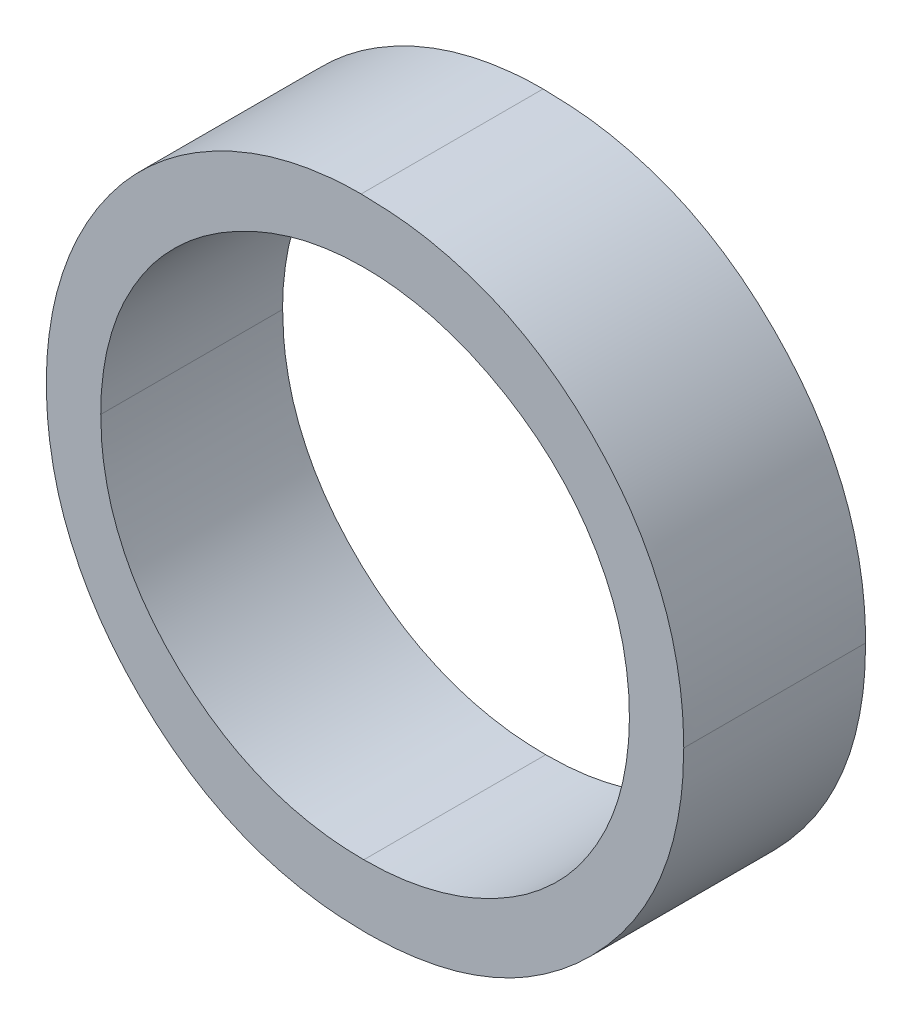
ISO-10303-21;
HEADER;
FILE_DESCRIPTION(('STEP AP214'),'2;1');
FILE_NAME('part.step','',(''),(''),'','','');
FILE_SCHEMA(('AUTOMOTIVE_DESIGN { 1 0 10303 214 1 1 1 1 }'));
ENDSEC;
DATA;
#1=APPLICATION_CONTEXT('core data for automotive mechanical design processes');
#2=APPLICATION_PROTOCOL_DEFINITION('international standard','automotive_design',2000,#1);
#3=PRODUCT_CONTEXT('',#1,'mechanical');
#4=PRODUCT('Part','Part','',(#3));
#5=PRODUCT_RELATED_PRODUCT_CATEGORY('part','',(#4));
#6=PRODUCT_DEFINITION_FORMATION('','',#4);
#7=PRODUCT_DEFINITION_CONTEXT('part definition',#1,'design');
#8=PRODUCT_DEFINITION('design','',#6,#7);
#9=PRODUCT_DEFINITION_SHAPE('','',#8);
#10=(LENGTH_UNIT() NAMED_UNIT(*) SI_UNIT(.MILLI.,.METRE.));
#11=(NAMED_UNIT(*) PLANE_ANGLE_UNIT() SI_UNIT($,.RADIAN.));
#12=(NAMED_UNIT(*) SI_UNIT($,.STERADIAN.) SOLID_ANGLE_UNIT());
#13=UNCERTAINTY_MEASURE_WITH_UNIT(LENGTH_MEASURE(1.E-05),#10,'distance_accuracy_value','');
#14=(GEOMETRIC_REPRESENTATION_CONTEXT(3) GLOBAL_UNCERTAINTY_ASSIGNED_CONTEXT((#13)) GLOBAL_UNIT_ASSIGNED_CONTEXT((#10,
#11,#12)) REPRESENTATION_CONTEXT('',''));
#15=CARTESIAN_POINT('',(0.,0.,0.));
#16=DIRECTION('',(0.,0.,1.));
#17=DIRECTION('',(1.,0.,0.));
#18=AXIS2_PLACEMENT_3D('',#15,#16,#17);
#19=CARTESIAN_POINT('',(-54.9444995379631,-18.5212303557436,1.5));
#20=DIRECTION('',(0.,0.,1.));
#21=DIRECTION('',(1.,0.,0.));
#22=AXIS2_PLACEMENT_3D('',#19,#20,#21);
#23=PLANE('',#22);
#24=CARTESIAN_POINT('',(-55.6888755822798,-20.3921543326411,1.5));
#25=CARTESIAN_POINT('',(-55.6881118172725,-20.3326790910173,1.5));
#26=CARTESIAN_POINT('',(-55.6865939224955,-20.2144789145793,1.5));
#27=CARTESIAN_POINT('',(-55.6683200761115,-20.0389552000759,1.5));
#28=CARTESIAN_POINT('',(-55.6418033601019,-19.8662542604088,1.5));
#29=CARTESIAN_POINT('',(-55.6038006278884,-19.6968671918883,1.5));
#30=CARTESIAN_POINT('',(-55.5540982464792,-19.5312086423136,1.5));
#31=CARTESIAN_POINT('',(-55.4954524930645,-19.368136123976,1.5));
#32=CARTESIAN_POINT('',(-55.4238241425538,-19.2093022329111,1.5));
#33=CARTESIAN_POINT('',(-55.3428517882126,-19.0539545304666,1.5));
#34=CARTESIAN_POINT('',(-55.2524777767514,-18.9045146649862,1.5));
#35=CARTESIAN_POINT('',(-55.1526552775343,-18.7632581176275,1.5));
#36=CARTESIAN_POINT('',(-55.0468904654373,-18.6289995507957,1.5));
#37=CARTESIAN_POINT('',(-54.9309427602544,-18.5052181167399,1.5));
#38=CARTESIAN_POINT('',(-54.8086335528322,-18.3883128933257,1.5));
#39=CARTESIAN_POINT('',(-54.6779787269262,-18.2800804404397,1.5));
#40=CARTESIAN_POINT('',(-54.5397755206897,-18.1795447962161,1.5));
#41=CARTESIAN_POINT('',(-54.3934292638817,-18.0889443089583,1.5));
#42=CARTESIAN_POINT('',(-54.2425460140538,-18.0070026880785,1.5));
#43=CARTESIAN_POINT('',(-54.0870077600833,-17.9366857581032,1.5));
#44=CARTESIAN_POINT('',(-53.9289269436466,-17.8763342416596,1.5));
#45=CARTESIAN_POINT('',(-53.7675631608959,-17.8274187770924,1.5));
#46=CARTESIAN_POINT('',(-53.6033449150669,-17.7888015828181,1.5));
#47=CARTESIAN_POINT('',(-53.4359137942485,-17.762505363234,1.5));
#48=CARTESIAN_POINT('',(-53.2654031852779,-17.744184909109,1.5));
#49=CARTESIAN_POINT('',(-53.1505298724922,-17.7426741919814,1.5));
#50=CARTESIAN_POINT('',(-53.0927217361259,-17.7419139480257,1.5));
#51=B_SPLINE_CURVE_WITH_KNOTS('',3,(#24,#25,#26,#27,#28,#29,#30,#31,#32,#33,#34,#35,#36,#37,#38,
#39,#40,#41,#42,#43,#44,#45,#46,#47,#48,#49,#50),.UNSPECIFIED.,.F.,.F.,(4,1,1,1,1,1,1,1,1,1,1,1,
1,1,1,1,1,1,1,1,1,1,1,1,4),(0.,0.0432089861713361,0.085872871630619,0.128120006696702,
0.170151964454199,0.211917620987861,0.253753002619124,0.29600640885595,0.338443357144784,
0.381015368162033,0.42282047944076,0.464089055794314,0.505125848683686,0.545974970685241,
0.586985211133859,0.628338591634663,0.670083801591206,0.711991602363722,0.753039154863019,
0.794049395311638,0.834885542701582,0.875498312929514,0.916547299830379,0.95800377864496,1.),.UNSPECIFIED.);
#52=CARTESIAN_POINT('',(-55.6888755822798,-20.3921543326411,1.5));
#53=VERTEX_POINT('',#52);
#54=CARTESIAN_POINT('',(-53.0927217361259,-17.7419139480257,1.5));
#55=VERTEX_POINT('',#54);
#56=EDGE_CURVE('E201',#53,#55,#51,.T.);
#57=ORIENTED_EDGE('',*,*,#56,.F.);
#58=CARTESIAN_POINT('',(-53.0526576335618,-22.998324204436,1.5));
#59=CARTESIAN_POINT('',(-53.1432638035327,-22.9961107946441,1.5));
#60=CARTESIAN_POINT('',(-53.3218726834446,-22.991747574746,1.5));
#61=CARTESIAN_POINT('',(-53.5840684482729,-22.954345567886,1.5));
#62=CARTESIAN_POINT('',(-53.8358937966268,-22.8958579910271,1.5));
#63=CARTESIAN_POINT('',(-54.0766285840731,-22.8122730821434,1.5));
#64=CARTESIAN_POINT('',(-54.306407054928,-22.7042484668222,1.5));
#65=CARTESIAN_POINT('',(-54.5256786016345,-22.5725279253008,1.5));
#66=CARTESIAN_POINT('',(-54.733563097694,-22.4162320093285,1.5));
#67=CARTESIAN_POINT('',(-54.9283370212433,-22.2388511884985,1.5));
#68=CARTESIAN_POINT('',(-55.106550161504,-22.0457489713331,1.5));
#69=CARTESIAN_POINT('',(-55.2619206982081,-21.8388428926499,1.5));
#70=CARTESIAN_POINT('',(-55.3936708600927,-21.6221922403021,1.5));
#71=CARTESIAN_POINT('',(-55.5013327636573,-21.395195777284,1.5));
#72=CARTESIAN_POINT('',(-55.5865677055783,-21.1589508591386,1.5));
#73=CARTESIAN_POINT('',(-55.644717445777,-20.9118816055822,1.5));
#74=CARTESIAN_POINT('',(-55.6823402344468,-20.6553965972754,1.5));
#75=CARTESIAN_POINT('',(-55.6866757294207,-20.4807638853821,1.5));
#76=CARTESIAN_POINT('',(-55.6888755822798,-20.3921543326411,1.5));
#77=B_SPLINE_CURVE_WITH_KNOTS('',3,(#58,#59,#60,#61,#62,#63,#64,#65,#66,#67,#68,#69,#70,#71,#72,
#73,#74,#75,#76),.UNSPECIFIED.,.F.,.F.,(4,1,1,1,1,1,1,1,1,1,1,1,1,1,1,1,4),(0.,
0.0658188768433069,0.129746526906831,0.192071954488006,0.253459424298203,0.314569587796421,
0.376279881188026,0.43902565366856,0.503267028829086,0.567492822879294,0.629704795605245,
0.690999649215756,0.751451650917447,0.812004364264694,0.873149681068043,0.935635483731785,1.),.UNSPECIFIED.);
#78=CARTESIAN_POINT('',(-53.0526576335618,-22.998324204436,1.5));
#79=VERTEX_POINT('',#78);
#80=EDGE_CURVE('E160',#79,#53,#77,.T.);
#81=ORIENTED_EDGE('',*,*,#80,.F.);
#82=CARTESIAN_POINT('',(-50.4324653258695,-20.3681158711026,1.5));
#83=CARTESIAN_POINT('',(-50.4346795151897,-20.4580550801834,1.5));
#84=CARTESIAN_POINT('',(-50.439043938855,-20.6353356808005,1.5));
#85=CARTESIAN_POINT('',(-50.4764279067629,-20.8955406010444,1.5));
#86=CARTESIAN_POINT('',(-50.5350579067258,-21.1456701674476,1.5));
#87=CARTESIAN_POINT('',(-50.6187668584152,-21.3853068142689,1.5));
#88=CARTESIAN_POINT('',(-50.7262318276485,-21.6147033339332,1.5));
#89=CARTESIAN_POINT('',(-50.8585963578356,-21.833256125193,1.5));
#90=CARTESIAN_POINT('',(-51.0145123731814,-22.0410368371729,1.5));
#91=CARTESIAN_POINT('',(-51.1919507318005,-22.2357692160638,1.5));
#92=CARTESIAN_POINT('',(-51.3853807918206,-22.4143370313404,1.5));
#93=CARTESIAN_POINT('',(-51.5928526015476,-22.5699354251742,1.5));
#94=CARTESIAN_POINT('',(-51.8097002014362,-22.7038270317441,1.5));
#95=CARTESIAN_POINT('',(-52.0387140702353,-22.8106608516944,1.5));
#96=CARTESIAN_POINT('',(-52.2768569799874,-22.8960493094731,1.5));
#97=CARTESIAN_POINT('',(-52.5262602986853,-22.9542673523751,1.5));
#98=CARTESIAN_POINT('',(-52.7857553758858,-22.9918202713066,1.5));
#99=CARTESIAN_POINT('',(-52.9627139527466,-22.9961324369683,1.5));
#100=CARTESIAN_POINT('',(-53.0526576335618,-22.998324204436,1.5));
#101=B_SPLINE_CURVE_WITH_KNOTS('',3,(#82,#83,#84,#85,#86,#87,#88,#89,#90,#91,#92,#93,#94,#95,
#96,#97,#98,#99,#100),.UNSPECIFIED.,.F.,.F.,(4,1,1,1,1,1,1,1,1,1,1,1,1,1,1,1,4),(0.,
0.0652265038922762,0.128568995706729,0.190320378104467,0.251377988624063,0.312387528333694,
0.373788704276724,0.43643115978045,0.500566755309855,0.564686795384744,0.627135517883514,
0.688455408894979,0.749245746463748,0.810155177364678,0.871670925652924,0.934773496107725,1.),.UNSPECIFIED.);
#102=CARTESIAN_POINT('',(-50.4324653258695,-20.3681158711026,1.5));
#103=VERTEX_POINT('',#102);
#104=EDGE_CURVE('E166',#103,#79,#101,.T.);
#105=ORIENTED_EDGE('',*,*,#104,.F.);
#106=CARTESIAN_POINT('',(-53.0927217361259,-17.7419139480257,1.5));
#107=CARTESIAN_POINT('',(-53.0001387276859,-17.7442589185558,1.5));
#108=CARTESIAN_POINT('',(-52.8182980606058,-17.7488646341472,1.5));
#109=CARTESIAN_POINT('',(-52.5510482067144,-17.7841204963692,1.5));
#110=CARTESIAN_POINT('',(-52.2959123563079,-17.8451139106079,1.5));
#111=CARTESIAN_POINT('',(-52.0508121580197,-17.9263467427232,1.5));
#112=CARTESIAN_POINT('',(-51.8186793343493,-18.03471015041,1.5));
#113=CARTESIAN_POINT('',(-51.5977666307914,-18.1656889337522,1.5));
#114=CARTESIAN_POINT('',(-51.3885996681834,-18.3206553034069,1.5));
#115=CARTESIAN_POINT('',(-51.1939976945714,-18.4984113417663,1.5));
#116=CARTESIAN_POINT('',(-51.015916337024,-18.6918162759114,1.5));
#117=CARTESIAN_POINT('',(-50.8590222137821,-18.8982132903013,1.5));
#118=CARTESIAN_POINT('',(-50.7275332227368,-19.1163544364537,1.5));
#119=CARTESIAN_POINT('',(-50.6195535267865,-19.3455841945133,1.5));
#120=CARTESIAN_POINT('',(-50.5348412272239,-19.5853841487628,1.5));
#121=CARTESIAN_POINT('',(-50.476385450523,-19.8370327241076,1.5));
#122=CARTESIAN_POINT('',(-50.4390452360188,-20.0988994242105,1.5));
#123=CARTESIAN_POINT('',(-50.4346798397224,-20.2775092309587,1.5));
#124=CARTESIAN_POINT('',(-50.4324653258695,-20.3681158711026,1.5));
#125=B_SPLINE_CURVE_WITH_KNOTS('',3,(#106,#107,#108,#109,#110,#111,#112,#113,#114,#115,#116,
#117,#118,#119,#120,#121,#122,#123,#124),.UNSPECIFIED.,.F.,.F.,(4,1,1,1,1,1,1,1,1,1,1,1,1,1,1,1,
4),(0.,0.0665700352151794,0.130749041482178,0.193412800029504,0.254989398889709,
0.316113555875901,0.377261757908984,0.439400784155553,0.502970589371976,0.566524976360731,
0.628231102513308,0.689090610599862,0.749344668995804,0.810169593372206,0.871609824317043,
0.934869184072764,1.),.UNSPECIFIED.);
#126=EDGE_CURVE('E221',#55,#103,#125,.T.);
#127=ORIENTED_EDGE('',*,*,#126,.F.);
#128=EDGE_LOOP('',(#57,#81,#105,#127));
#129=FACE_BOUND('',#128,.T.);
#130=CARTESIAN_POINT('',(-53.0706864797157,-18.2547344608462,1.5));
#131=CARTESIAN_POINT('',(-53.1181359562105,-18.2553128754937,1.5));
#132=CARTESIAN_POINT('',(-53.2125812889727,-18.2564641751052,1.5));
#133=CARTESIAN_POINT('',(-53.3529877693252,-18.2716294830654,1.5));
#134=CARTESIAN_POINT('',(-53.4915476747978,-18.2932436101674,1.5));
#135=CARTESIAN_POINT('',(-53.6282896207573,-18.3240743541167,1.5));
#136=CARTESIAN_POINT('',(-53.7626414627256,-18.3660801437933,1.5));
#137=CARTESIAN_POINT('',(-53.8958555215443,-18.4144242983496,1.5));
#138=CARTESIAN_POINT('',(-54.026717027071,-18.4733115706288,1.5));
#139=CARTESIAN_POINT('',(-54.1547939668658,-18.5398440054426,1.5));
#140=CARTESIAN_POINT('',(-54.2789583599315,-18.6134853208765,1.5));
#141=CARTESIAN_POINT('',(-54.3961193620098,-18.6948735594981,1.5));
#142=CARTESIAN_POINT('',(-54.506580281958,-18.7821000655657,1.5));
#143=CARTESIAN_POINT('',(-54.6100706628904,-18.8753684046761,1.5));
#144=CARTESIAN_POINT('',(-54.7062866231397,-18.9751535500921,1.5));
#145=CARTESIAN_POINT('',(-54.7971219109294,-19.079942744546,1.5));
#146=CARTESIAN_POINT('',(-54.8789355989952,-19.1927311603226,1.5));
#147=CARTESIAN_POINT('',(-54.9539149944622,-19.3104603129896,1.5));
#148=CARTESIAN_POINT('',(-55.0210119091442,-19.4329768575693,1.5));
#149=CARTESIAN_POINT('',(-55.0806767016049,-19.5589909465235,1.5));
#150=CARTESIAN_POINT('',(-55.1294824284699,-19.689530499064,1.5));
#151=CARTESIAN_POINT('',(-55.1692858231615,-19.8231792956015,1.5));
#152=CARTESIAN_POINT('',(-55.2022855529426,-19.9597256665493,1.5));
#153=CARTESIAN_POINT('',(-55.2231911587917,-20.1002054506054,1.5));
#154=CARTESIAN_POINT('',(-55.2385231008612,-20.2439127535048,1.5));
#155=CARTESIAN_POINT('',(-55.2396085943649,-20.3410296878508,1.5));
#156=CARTESIAN_POINT('',(-55.2401576335619,-20.3901511275129,1.5));
#157=B_SPLINE_CURVE_WITH_KNOTS('',3,(#130,#131,#132,#133,#134,#135,#136,#137,#138,#139,#140,
#141,#142,#143,#144,#145,#146,#147,#148,#149,#150,#151,#152,#153,#154,#155,#156),.UNSPECIFIED.,
.F.,.F.,(4,1,1,1,1,1,1,1,1,1,1,1,1,1,1,1,1,1,1,1,1,1,1,1,4),(0.,0.0420233285259239,
0.0836449111687118,0.124983795417394,0.166247461172896,0.207701556096989,0.249631070799649,
0.29174177033213,0.334742875353199,0.377460168550865,0.41955631884194,0.461044176333034,
0.502096283944396,0.5428907140756,0.583800818626506,0.624863583310193,0.66622468906917,
0.707399186477937,0.748556677536694,0.78965459095218,0.830739726489832,0.872070142258604,
0.913993395242132,0.956498130067588,1.),.UNSPECIFIED.);
#158=CARTESIAN_POINT('',(-53.0706864797157,-18.2547344608462,1.5));
#159=VERTEX_POINT('',#158);
#160=CARTESIAN_POINT('',(-55.2401576335619,-20.3901511275129,1.5));
#161=VERTEX_POINT('',#160);
#162=EDGE_CURVE('E108',#159,#161,#157,.T.);
#163=ORIENTED_EDGE('',*,*,#162,.F.);
#164=CARTESIAN_POINT('',(-50.8811832745875,-20.3671142685385,1.5));
#165=CARTESIAN_POINT('',(-50.8817562931277,-20.318663548155,1.5));
#166=CARTESIAN_POINT('',(-50.882892980956,-20.2225526193365,1.5));
#167=CARTESIAN_POINT('',(-50.8979536589908,-20.0804657359631,1.5));
#168=CARTESIAN_POINT('',(-50.9195263595192,-19.9415325767148,1.5));
#169=CARTESIAN_POINT('',(-50.9506159424328,-19.8062985724348,1.5));
#170=CARTESIAN_POINT('',(-50.9906875906265,-19.6747292509108,1.5));
#171=CARTESIAN_POINT('',(-51.0400980626106,-19.5469481827663,1.5));
#172=CARTESIAN_POINT('',(-51.0983627761446,-19.4224793326474,1.5));
#173=CARTESIAN_POINT('',(-51.1652316681184,-19.3016303369334,1.5));
#174=CARTESIAN_POINT('',(-51.2403971302276,-19.1856664255227,1.5));
#175=CARTESIAN_POINT('',(-51.3225317635289,-19.0748058362006,1.5));
#176=CARTESIAN_POINT('',(-51.4130536894448,-18.9711304914712,1.5));
#177=CARTESIAN_POINT('',(-51.5093765821216,-18.8720809285521,1.5));
#178=CARTESIAN_POINT('',(-51.6139064183061,-18.7797696576838,1.5));
#179=CARTESIAN_POINT('',(-51.7261696955619,-18.6941660567445,1.5));
#180=CARTESIAN_POINT('',(-51.8448035209355,-18.6132042363317,1.5));
#181=CARTESIAN_POINT('',(-51.9704138572683,-18.5401677194165,1.5));
#182=CARTESIAN_POINT('',(-52.1000480768853,-18.4727188155405,1.5));
#183=CARTESIAN_POINT('',(-52.2330680168461,-18.4149316681911,1.5));
#184=CARTESIAN_POINT('',(-52.3679667305836,-18.3658286404948,1.5));
#185=CARTESIAN_POINT('',(-52.5044011767724,-18.3239472618512,1.5));
#186=CARTESIAN_POINT('',(-52.6435197172515,-18.2933643616453,1.5));
#187=CARTESIAN_POINT('',(-52.78438232989,-18.2716100047024,1.5));
#188=CARTESIAN_POINT('',(-52.9267941278551,-18.2564694534261,1.5));
#189=CARTESIAN_POINT('',(-53.0225701560316,-18.255314626946,1.5));
#190=CARTESIAN_POINT('',(-53.0706864797157,-18.2547344608462,1.5));
#191=B_SPLINE_CURVE_WITH_KNOTS('',3,(#164,#165,#166,#167,#168,#169,#170,#171,#172,#173,#174,
#175,#176,#177,#178,#179,#180,#181,#182,#183,#184,#185,#186,#187,#188,#189,#190),.UNSPECIFIED.,
.F.,.F.,(4,1,1,1,1,1,1,1,1,1,1,1,1,1,1,1,1,1,1,1,1,1,1,1,4),(0.,0.0429150821010496,
0.0851299705846994,0.126473318554998,0.167453037885388,0.207976332894988,0.24824937806376,
0.288749986983443,0.329669856910872,0.370537286711975,0.411128563917118,0.451818912673638,
0.492405876934263,0.533485861742023,0.575263062441552,0.617440612802191,0.660671688292366,
0.70394020424349,0.74686752215987,0.789079300394724,0.831104042457405,0.873237989854776,
0.915165769659334,0.957380658142984,1.),.UNSPECIFIED.);
#192=CARTESIAN_POINT('',(-50.8811832745875,-20.3671142685385,1.5));
#193=VERTEX_POINT('',#192);
#194=EDGE_CURVE('E100',#193,#159,#191,.T.);
#195=ORIENTED_EDGE('',*,*,#194,.F.);
#196=CARTESIAN_POINT('',(-53.0706864797157,-22.4855036916154,1.5));
#197=CARTESIAN_POINT('',(-53.0212443345554,-22.4848243996638,1.5));
#198=CARTESIAN_POINT('',(-52.9231857111632,-22.4834771597039,1.5));
#199=CARTESIAN_POINT('',(-52.7773349649449,-22.4699076213655,1.5));
#200=CARTESIAN_POINT('',(-52.6341118053293,-22.448147807911,1.5));
#201=CARTESIAN_POINT('',(-52.493717119786,-22.4168182998983,1.5));
#202=CARTESIAN_POINT('',(-52.3563102463768,-22.3776080050011,1.5));
#203=CARTESIAN_POINT('',(-52.2213176704983,-22.3310255364881,1.5));
#204=CARTESIAN_POINT('',(-52.0901772557561,-22.2729095312265,1.5));
#205=CARTESIAN_POINT('',(-51.9612346303258,-22.2086981718279,1.5));
#206=CARTESIAN_POINT('',(-51.8378114279099,-22.1354979467802,1.5));
#207=CARTESIAN_POINT('',(-51.719989238923,-22.0568720186955,1.5));
#208=CARTESIAN_POINT('',(-51.6107378391303,-21.96977398911,1.5));
#209=CARTESIAN_POINT('',(-51.5073248799575,-21.8778913997614,1.5));
#210=CARTESIAN_POINT('',(-51.4107138956824,-21.7793716171083,1.5));
#211=CARTESIAN_POINT('',(-51.3215582039322,-21.6743427287556,1.5));
#212=CARTESIAN_POINT('',(-51.2401580151463,-21.5621417898511,1.5));
#213=CARTESIAN_POINT('',(-51.1652070914191,-21.4445912102221,1.5));
#214=CARTESIAN_POINT('',(-51.0983452874822,-21.3217394206718,1.5));
#215=CARTESIAN_POINT('',(-51.0400894316978,-21.1952684521741,1.5));
#216=CARTESIAN_POINT('',(-50.9906664090796,-21.0654897245074,1.5));
#217=CARTESIAN_POINT('',(-50.9507685450378,-20.9322160509626,1.5));
#218=CARTESIAN_POINT('',(-50.9195035997762,-20.7957005527185,1.5));
#219=CARTESIAN_POINT('',(-50.8979608570505,-20.6557604410595,1.5));
#220=CARTESIAN_POINT('',(-50.8828916589834,-20.5126756660736,1.5));
#221=CARTESIAN_POINT('',(-50.881755834431,-20.4158987289854,1.5));
#222=CARTESIAN_POINT('',(-50.8811832745875,-20.3671142685385,1.5));
#223=B_SPLINE_CURVE_WITH_KNOTS('',3,(#196,#197,#198,#199,#200,#201,#202,#203,#204,#205,#206,
#207,#208,#209,#210,#211,#212,#213,#214,#215,#216,#217,#218,#219,#220,#221,#222),.UNSPECIFIED.,
.F.,.F.,(4,1,1,1,1,1,1,1,1,1,1,1,1,1,1,1,1,1,1,1,1,1,1,1,4),(0.,0.0436332182657575,
0.0865377766972015,0.129177336089891,0.171436323663827,0.213415894570908,0.255265954553849,
0.297369481156622,0.339940747898556,0.382347458751811,0.423952946815271,0.464871163261017,
0.505572294118272,0.546002577108316,0.586567974806912,0.627064799148167,0.668270684033174,
0.709549224850333,0.750428153513189,0.791096194448592,0.832027144779434,0.873135955335967,
0.914610764365448,0.956955986480437,1.),.UNSPECIFIED.);
#224=CARTESIAN_POINT('',(-53.0706864797157,-22.4855036916154,1.5));
#225=VERTEX_POINT('',#224);
#226=EDGE_CURVE('E122',#225,#193,#223,.T.);
#227=ORIENTED_EDGE('',*,*,#226,.F.);
#228=CARTESIAN_POINT('',(-55.2401576335619,-20.3901511275129,1.5));
#229=CARTESIAN_POINT('',(-55.2383364021939,-20.4623828715172,1.5));
#230=CARTESIAN_POINT('',(-55.2347534766767,-20.6044850576033,1.5));
#231=CARTESIAN_POINT('',(-55.2033855193691,-20.8127252631532,1.5));
#232=CARTESIAN_POINT('',(-55.1550684130079,-21.0128513865018,1.5));
#233=CARTESIAN_POINT('',(-55.0838436038126,-21.2037683997783,1.5));
#234=CARTESIAN_POINT('',(-54.9947712971588,-21.3871173752519,1.5));
#235=CARTESIAN_POINT('',(-54.8847328824807,-21.5612718105197,1.5));
#236=CARTESIAN_POINT('',(-54.7543627602392,-21.7262787738964,1.5));
#237=CARTESIAN_POINT('',(-54.6062720079509,-21.880986300996,1.5));
#238=CARTESIAN_POINT('',(-54.4443824270944,-22.0221945927667,1.5));
#239=CARTESIAN_POINT('',(-54.2724785271958,-22.1461423194026,1.5));
#240=CARTESIAN_POINT('',(-54.0924019450711,-22.2510141048647,1.5));
#241=CARTESIAN_POINT('',(-53.9036830840533,-22.3364499225552,1.5));
#242=CARTESIAN_POINT('',(-53.7073294568685,-22.4041495479824,1.5));
#243=CARTESIAN_POINT('',(-53.5020758125293,-22.4505475924503,1.5));
#244=CARTESIAN_POINT('',(-53.2892894416956,-22.4810839572616,1.5));
#245=CARTESIAN_POINT('',(-53.1442456486097,-22.4840164657203,1.5));
#246=CARTESIAN_POINT('',(-53.0706864797157,-22.4855036916154,1.5));
#247=B_SPLINE_CURVE_WITH_KNOTS('',3,(#228,#229,#230,#231,#232,#233,#234,#235,#236,#237,#238,
#239,#240,#241,#242,#243,#244,#245,#246),.UNSPECIFIED.,.F.,.F.,(4,1,1,1,1,1,1,1,1,1,1,1,1,1,1,1,
4),(0.,0.0645039992970557,0.126899321590039,0.187746540100011,0.248149732929826,
0.308586064762742,0.369583005086994,0.431826965381049,0.496179722524157,0.56066785461188,
0.623504455117664,0.685260411330427,0.746536821751166,0.808327351736707,0.870486187887767,
0.934316883359246,1.),.UNSPECIFIED.);
#248=EDGE_CURVE('E120',#161,#225,#247,.T.);
#249=ORIENTED_EDGE('',*,*,#248,.F.);
#250=EDGE_LOOP('',(#163,#195,#227,#249));
#251=FACE_BOUND('',#250,.T.);
#252=ADVANCED_FACE('F33',(#129,#251),#23,.T.);
#253=CARTESIAN_POINT('',(-54.9444995379631,-18.5212303557436,0.));
#254=DIRECTION('',(0.,0.,1.));
#255=DIRECTION('',(1.,0.,0.));
#256=AXIS2_PLACEMENT_3D('',#253,#254,#255);
#257=PLANE('',#256);
#258=CARTESIAN_POINT('',(-55.6888755822798,-20.3921543326411,0.));
#259=CARTESIAN_POINT('',(-55.6881118172725,-20.3326790910173,0.));
#260=CARTESIAN_POINT('',(-55.6865939224955,-20.2144789145793,0.));
#261=CARTESIAN_POINT('',(-55.6683200761115,-20.0389552000759,0.));
#262=CARTESIAN_POINT('',(-55.6418033601019,-19.8662542604088,0.));
#263=CARTESIAN_POINT('',(-55.6038006278884,-19.6968671918883,0.));
#264=CARTESIAN_POINT('',(-55.5540982464792,-19.5312086423136,0.));
#265=CARTESIAN_POINT('',(-55.4954524930645,-19.368136123976,0.));
#266=CARTESIAN_POINT('',(-55.4238241425538,-19.2093022329111,0.));
#267=CARTESIAN_POINT('',(-55.3428517882126,-19.0539545304666,0.));
#268=CARTESIAN_POINT('',(-55.2524777767514,-18.9045146649862,0.));
#269=CARTESIAN_POINT('',(-55.1526552775343,-18.7632581176275,0.));
#270=CARTESIAN_POINT('',(-55.0468904654373,-18.6289995507957,0.));
#271=CARTESIAN_POINT('',(-54.9309427602544,-18.5052181167399,0.));
#272=CARTESIAN_POINT('',(-54.8086335528322,-18.3883128933257,0.));
#273=CARTESIAN_POINT('',(-54.6779787269262,-18.2800804404397,0.));
#274=CARTESIAN_POINT('',(-54.5397755206897,-18.1795447962161,0.));
#275=CARTESIAN_POINT('',(-54.3934292638817,-18.0889443089583,0.));
#276=CARTESIAN_POINT('',(-54.2425460140538,-18.0070026880785,0.));
#277=CARTESIAN_POINT('',(-54.0870077600833,-17.9366857581032,0.));
#278=CARTESIAN_POINT('',(-53.9289269436466,-17.8763342416596,0.));
#279=CARTESIAN_POINT('',(-53.7675631608959,-17.8274187770924,0.));
#280=CARTESIAN_POINT('',(-53.6033449150669,-17.7888015828181,0.));
#281=CARTESIAN_POINT('',(-53.4359137942485,-17.762505363234,0.));
#282=CARTESIAN_POINT('',(-53.2654031852779,-17.744184909109,0.));
#283=CARTESIAN_POINT('',(-53.1505298724922,-17.7426741919814,0.));
#284=CARTESIAN_POINT('',(-53.0927217361259,-17.7419139480257,0.));
#285=B_SPLINE_CURVE_WITH_KNOTS('',3,(#258,#259,#260,#261,#262,#263,#264,#265,#266,#267,#268,
#269,#270,#271,#272,#273,#274,#275,#276,#277,#278,#279,#280,#281,#282,#283,#284),.UNSPECIFIED.,
.F.,.F.,(4,1,1,1,1,1,1,1,1,1,1,1,1,1,1,1,1,1,1,1,1,1,1,1,4),(0.,0.0432089861713361,
0.085872871630619,0.128120006696702,0.170151964454199,0.211917620987861,0.253753002619124,
0.29600640885595,0.338443357144784,0.381015368162033,0.42282047944076,0.464089055794314,
0.505125848683686,0.545974970685241,0.586985211133859,0.628338591634663,0.670083801591206,
0.711991602363722,0.753039154863019,0.794049395311638,0.834885542701582,0.875498312929514,
0.916547299830379,0.95800377864496,1.),.UNSPECIFIED.);
#286=CARTESIAN_POINT('',(-55.6888755822798,-20.3921543326411,0.));
#287=VERTEX_POINT('',#286);
#288=CARTESIAN_POINT('',(-53.0927217361259,-17.7419139480257,0.));
#289=VERTEX_POINT('',#288);
#290=EDGE_CURVE('E116',#287,#289,#285,.T.);
#291=ORIENTED_EDGE('',*,*,#290,.T.);
#292=CARTESIAN_POINT('',(-53.0927217361259,-17.7419139480257,0.));
#293=CARTESIAN_POINT('',(-53.0001387276859,-17.7442589185558,0.));
#294=CARTESIAN_POINT('',(-52.8182980606058,-17.7488646341472,0.));
#295=CARTESIAN_POINT('',(-52.5510482067144,-17.7841204963692,0.));
#296=CARTESIAN_POINT('',(-52.2959123563079,-17.8451139106079,0.));
#297=CARTESIAN_POINT('',(-52.0508121580197,-17.9263467427232,0.));
#298=CARTESIAN_POINT('',(-51.8186793343493,-18.03471015041,0.));
#299=CARTESIAN_POINT('',(-51.5977666307914,-18.1656889337522,0.));
#300=CARTESIAN_POINT('',(-51.3885996681834,-18.3206553034069,0.));
#301=CARTESIAN_POINT('',(-51.1939976945714,-18.4984113417663,0.));
#302=CARTESIAN_POINT('',(-51.015916337024,-18.6918162759114,0.));
#303=CARTESIAN_POINT('',(-50.8590222137821,-18.8982132903013,0.));
#304=CARTESIAN_POINT('',(-50.7275332227368,-19.1163544364537,0.));
#305=CARTESIAN_POINT('',(-50.6195535267865,-19.3455841945133,0.));
#306=CARTESIAN_POINT('',(-50.5348412272239,-19.5853841487628,0.));
#307=CARTESIAN_POINT('',(-50.476385450523,-19.8370327241076,0.));
#308=CARTESIAN_POINT('',(-50.4390452360188,-20.0988994242105,0.));
#309=CARTESIAN_POINT('',(-50.4346798397224,-20.2775092309587,0.));
#310=CARTESIAN_POINT('',(-50.4324653258695,-20.3681158711026,0.));
#311=B_SPLINE_CURVE_WITH_KNOTS('',3,(#292,#293,#294,#295,#296,#297,#298,#299,#300,#301,#302,
#303,#304,#305,#306,#307,#308,#309,#310),.UNSPECIFIED.,.F.,.F.,(4,1,1,1,1,1,1,1,1,1,1,1,1,1,1,1,
4),(0.,0.0665700352151794,0.130749041482178,0.193412800029504,0.254989398889709,
0.316113555875901,0.377261757908984,0.439400784155553,0.502970589371976,0.566524976360731,
0.628231102513308,0.689090610599862,0.749344668995804,0.810169593372206,0.871609824317043,
0.934869184072764,1.),.UNSPECIFIED.);
#312=CARTESIAN_POINT('',(-50.4324653258695,-20.3681158711026,0.));
#313=VERTEX_POINT('',#312);
#314=EDGE_CURVE('E178',#289,#313,#311,.T.);
#315=ORIENTED_EDGE('',*,*,#314,.T.);
#316=CARTESIAN_POINT('',(-50.4324653258695,-20.3681158711026,0.));
#317=CARTESIAN_POINT('',(-50.4346795151897,-20.4580550801834,0.));
#318=CARTESIAN_POINT('',(-50.439043938855,-20.6353356808005,0.));
#319=CARTESIAN_POINT('',(-50.4764279067629,-20.8955406010444,0.));
#320=CARTESIAN_POINT('',(-50.5350579067258,-21.1456701674476,0.));
#321=CARTESIAN_POINT('',(-50.6187668584152,-21.3853068142689,0.));
#322=CARTESIAN_POINT('',(-50.7262318276485,-21.6147033339332,0.));
#323=CARTESIAN_POINT('',(-50.8585963578356,-21.833256125193,0.));
#324=CARTESIAN_POINT('',(-51.0145123731814,-22.0410368371729,0.));
#325=CARTESIAN_POINT('',(-51.1919507318005,-22.2357692160638,0.));
#326=CARTESIAN_POINT('',(-51.3853807918206,-22.4143370313404,0.));
#327=CARTESIAN_POINT('',(-51.5928526015476,-22.5699354251742,0.));
#328=CARTESIAN_POINT('',(-51.8097002014362,-22.7038270317441,0.));
#329=CARTESIAN_POINT('',(-52.0387140702353,-22.8106608516944,0.));
#330=CARTESIAN_POINT('',(-52.2768569799874,-22.8960493094731,0.));
#331=CARTESIAN_POINT('',(-52.5262602986853,-22.9542673523751,0.));
#332=CARTESIAN_POINT('',(-52.7857553758858,-22.9918202713066,0.));
#333=CARTESIAN_POINT('',(-52.9627139527466,-22.9961324369683,0.));
#334=CARTESIAN_POINT('',(-53.0526576335618,-22.998324204436,0.));
#335=B_SPLINE_CURVE_WITH_KNOTS('',3,(#316,#317,#318,#319,#320,#321,#322,#323,#324,#325,#326,
#327,#328,#329,#330,#331,#332,#333,#334),.UNSPECIFIED.,.F.,.F.,(4,1,1,1,1,1,1,1,1,1,1,1,1,1,1,1,
4),(0.,0.0652265038922762,0.128568995706729,0.190320378104467,0.251377988624063,
0.312387528333694,0.373788704276724,0.43643115978045,0.500566755309855,0.564686795384744,
0.627135517883514,0.688455408894979,0.749245746463748,0.810155177364678,0.871670925652924,
0.934773496107725,1.),.UNSPECIFIED.);
#336=CARTESIAN_POINT('',(-53.0526576335618,-22.998324204436,0.));
#337=VERTEX_POINT('',#336);
#338=EDGE_CURVE('E186',#313,#337,#335,.T.);
#339=ORIENTED_EDGE('',*,*,#338,.T.);
#340=CARTESIAN_POINT('',(-53.0526576335618,-22.998324204436,0.));
#341=CARTESIAN_POINT('',(-53.1432638035327,-22.9961107946441,0.));
#342=CARTESIAN_POINT('',(-53.3218726834446,-22.991747574746,0.));
#343=CARTESIAN_POINT('',(-53.5840684482729,-22.954345567886,0.));
#344=CARTESIAN_POINT('',(-53.8358937966268,-22.8958579910271,0.));
#345=CARTESIAN_POINT('',(-54.0766285840731,-22.8122730821434,0.));
#346=CARTESIAN_POINT('',(-54.306407054928,-22.7042484668222,0.));
#347=CARTESIAN_POINT('',(-54.5256786016345,-22.5725279253008,0.));
#348=CARTESIAN_POINT('',(-54.733563097694,-22.4162320093285,0.));
#349=CARTESIAN_POINT('',(-54.9283370212433,-22.2388511884985,0.));
#350=CARTESIAN_POINT('',(-55.106550161504,-22.0457489713331,0.));
#351=CARTESIAN_POINT('',(-55.2619206982081,-21.8388428926499,0.));
#352=CARTESIAN_POINT('',(-55.3936708600927,-21.6221922403021,0.));
#353=CARTESIAN_POINT('',(-55.5013327636573,-21.395195777284,0.));
#354=CARTESIAN_POINT('',(-55.5865677055783,-21.1589508591386,0.));
#355=CARTESIAN_POINT('',(-55.644717445777,-20.9118816055822,0.));
#356=CARTESIAN_POINT('',(-55.6823402344468,-20.6553965972754,0.));
#357=CARTESIAN_POINT('',(-55.6866757294207,-20.4807638853821,0.));
#358=CARTESIAN_POINT('',(-55.6888755822798,-20.3921543326411,0.));
#359=B_SPLINE_CURVE_WITH_KNOTS('',3,(#340,#341,#342,#343,#344,#345,#346,#347,#348,#349,#350,
#351,#352,#353,#354,#355,#356,#357,#358),.UNSPECIFIED.,.F.,.F.,(4,1,1,1,1,1,1,1,1,1,1,1,1,1,1,1,
4),(0.,0.0658188768433069,0.129746526906831,0.192071954488006,0.253459424298203,
0.314569587796421,0.376279881188026,0.43902565366856,0.503267028829086,0.567492822879294,
0.629704795605245,0.690999649215756,0.751451650917447,0.812004364264694,0.873149681068043,
0.935635483731785,1.),.UNSPECIFIED.);
#360=EDGE_CURVE('E194',#337,#287,#359,.T.);
#361=ORIENTED_EDGE('',*,*,#360,.T.);
#362=EDGE_LOOP('',(#291,#315,#339,#361));
#363=FACE_BOUND('',#362,.T.);
#364=CARTESIAN_POINT('',(-50.8811832745875,-20.3671142685385,0.));
#365=CARTESIAN_POINT('',(-50.8817562931277,-20.318663548155,0.));
#366=CARTESIAN_POINT('',(-50.882892980956,-20.2225526193365,0.));
#367=CARTESIAN_POINT('',(-50.8979536589908,-20.0804657359631,0.));
#368=CARTESIAN_POINT('',(-50.9195263595192,-19.9415325767148,0.));
#369=CARTESIAN_POINT('',(-50.9506159424328,-19.8062985724348,0.));
#370=CARTESIAN_POINT('',(-50.9906875906265,-19.6747292509108,0.));
#371=CARTESIAN_POINT('',(-51.0400980626106,-19.5469481827663,0.));
#372=CARTESIAN_POINT('',(-51.0983627761446,-19.4224793326474,0.));
#373=CARTESIAN_POINT('',(-51.1652316681184,-19.3016303369334,0.));
#374=CARTESIAN_POINT('',(-51.2403971302276,-19.1856664255227,0.));
#375=CARTESIAN_POINT('',(-51.3225317635289,-19.0748058362006,0.));
#376=CARTESIAN_POINT('',(-51.4130536894448,-18.9711304914712,0.));
#377=CARTESIAN_POINT('',(-51.5093765821216,-18.8720809285521,0.));
#378=CARTESIAN_POINT('',(-51.6139064183061,-18.7797696576838,0.));
#379=CARTESIAN_POINT('',(-51.7261696955619,-18.6941660567445,0.));
#380=CARTESIAN_POINT('',(-51.8448035209355,-18.6132042363317,0.));
#381=CARTESIAN_POINT('',(-51.9704138572683,-18.5401677194165,0.));
#382=CARTESIAN_POINT('',(-52.1000480768853,-18.4727188155405,0.));
#383=CARTESIAN_POINT('',(-52.2330680168461,-18.4149316681911,0.));
#384=CARTESIAN_POINT('',(-52.3679667305836,-18.3658286404948,0.));
#385=CARTESIAN_POINT('',(-52.5044011767724,-18.3239472618512,0.));
#386=CARTESIAN_POINT('',(-52.6435197172515,-18.2933643616453,0.));
#387=CARTESIAN_POINT('',(-52.78438232989,-18.2716100047024,0.));
#388=CARTESIAN_POINT('',(-52.9267941278551,-18.2564694534261,0.));
#389=CARTESIAN_POINT('',(-53.0225701560316,-18.255314626946,0.));
#390=CARTESIAN_POINT('',(-53.0706864797157,-18.2547344608462,0.));
#391=B_SPLINE_CURVE_WITH_KNOTS('',3,(#364,#365,#366,#367,#368,#369,#370,#371,#372,#373,#374,
#375,#376,#377,#378,#379,#380,#381,#382,#383,#384,#385,#386,#387,#388,#389,#390),.UNSPECIFIED.,
.F.,.F.,(4,1,1,1,1,1,1,1,1,1,1,1,1,1,1,1,1,1,1,1,1,1,1,1,4),(0.,0.0429150821010496,
0.0851299705846994,0.126473318554998,0.167453037885388,0.207976332894988,0.24824937806376,
0.288749986983443,0.329669856910872,0.370537286711975,0.411128563917118,0.451818912673638,
0.492405876934263,0.533485861742023,0.575263062441552,0.617440612802191,0.660671688292366,
0.70394020424349,0.74686752215987,0.789079300394724,0.831104042457405,0.873237989854776,
0.915165769659334,0.957380658142984,1.),.UNSPECIFIED.);
#392=CARTESIAN_POINT('',(-50.8811832745875,-20.3671142685385,0.));
#393=VERTEX_POINT('',#392);
#394=CARTESIAN_POINT('',(-53.0706864797157,-18.2547344608462,0.));
#395=VERTEX_POINT('',#394);
#396=EDGE_CURVE('E59',#393,#395,#391,.T.);
#397=ORIENTED_EDGE('',*,*,#396,.T.);
#398=CARTESIAN_POINT('',(-53.0706864797157,-18.2547344608462,0.));
#399=CARTESIAN_POINT('',(-53.1181359562105,-18.2553128754937,0.));
#400=CARTESIAN_POINT('',(-53.2125812889727,-18.2564641751052,0.));
#401=CARTESIAN_POINT('',(-53.3529877693252,-18.2716294830654,0.));
#402=CARTESIAN_POINT('',(-53.4915476747978,-18.2932436101674,0.));
#403=CARTESIAN_POINT('',(-53.6282896207573,-18.3240743541167,0.));
#404=CARTESIAN_POINT('',(-53.7626414627256,-18.3660801437933,0.));
#405=CARTESIAN_POINT('',(-53.8958555215443,-18.4144242983496,0.));
#406=CARTESIAN_POINT('',(-54.026717027071,-18.4733115706288,0.));
#407=CARTESIAN_POINT('',(-54.1547939668658,-18.5398440054426,0.));
#408=CARTESIAN_POINT('',(-54.2789583599315,-18.6134853208765,0.));
#409=CARTESIAN_POINT('',(-54.3961193620098,-18.6948735594981,0.));
#410=CARTESIAN_POINT('',(-54.506580281958,-18.7821000655657,0.));
#411=CARTESIAN_POINT('',(-54.6100706628904,-18.8753684046761,0.));
#412=CARTESIAN_POINT('',(-54.7062866231397,-18.9751535500921,0.));
#413=CARTESIAN_POINT('',(-54.7971219109294,-19.079942744546,0.));
#414=CARTESIAN_POINT('',(-54.8789355989952,-19.1927311603226,0.));
#415=CARTESIAN_POINT('',(-54.9539149944622,-19.3104603129896,0.));
#416=CARTESIAN_POINT('',(-55.0210119091442,-19.4329768575693,0.));
#417=CARTESIAN_POINT('',(-55.0806767016049,-19.5589909465235,0.));
#418=CARTESIAN_POINT('',(-55.1294824284699,-19.689530499064,0.));
#419=CARTESIAN_POINT('',(-55.1692858231615,-19.8231792956015,0.));
#420=CARTESIAN_POINT('',(-55.2022855529426,-19.9597256665493,0.));
#421=CARTESIAN_POINT('',(-55.2231911587917,-20.1002054506054,0.));
#422=CARTESIAN_POINT('',(-55.2385231008612,-20.2439127535048,0.));
#423=CARTESIAN_POINT('',(-55.2396085943649,-20.3410296878508,0.));
#424=CARTESIAN_POINT('',(-55.2401576335619,-20.3901511275129,0.));
#425=B_SPLINE_CURVE_WITH_KNOTS('',3,(#398,#399,#400,#401,#402,#403,#404,#405,#406,#407,#408,
#409,#410,#411,#412,#413,#414,#415,#416,#417,#418,#419,#420,#421,#422,#423,#424),.UNSPECIFIED.,
.F.,.F.,(4,1,1,1,1,1,1,1,1,1,1,1,1,1,1,1,1,1,1,1,1,1,1,1,4),(0.,0.0420233285259239,
0.0836449111687118,0.124983795417394,0.166247461172896,0.207701556096989,0.249631070799649,
0.29174177033213,0.334742875353199,0.377460168550865,0.41955631884194,0.461044176333034,
0.502096283944396,0.5428907140756,0.583800818626506,0.624863583310193,0.66622468906917,
0.707399186477937,0.748556677536694,0.78965459095218,0.830739726489832,0.872070142258604,
0.913993395242132,0.956498130067588,1.),.UNSPECIFIED.);
#426=CARTESIAN_POINT('',(-55.2401576335619,-20.3901511275129,0.));
#427=VERTEX_POINT('',#426);
#428=EDGE_CURVE('E115',#395,#427,#425,.T.);
#429=ORIENTED_EDGE('',*,*,#428,.T.);
#430=CARTESIAN_POINT('',(-55.2401576335619,-20.3901511275129,0.));
#431=CARTESIAN_POINT('',(-55.2383364021939,-20.4623828715172,0.));
#432=CARTESIAN_POINT('',(-55.2347534766767,-20.6044850576033,0.));
#433=CARTESIAN_POINT('',(-55.2033855193691,-20.8127252631532,0.));
#434=CARTESIAN_POINT('',(-55.1550684130079,-21.0128513865018,0.));
#435=CARTESIAN_POINT('',(-55.0838436038126,-21.2037683997783,0.));
#436=CARTESIAN_POINT('',(-54.9947712971588,-21.3871173752519,0.));
#437=CARTESIAN_POINT('',(-54.8847328824807,-21.5612718105197,0.));
#438=CARTESIAN_POINT('',(-54.7543627602392,-21.7262787738964,0.));
#439=CARTESIAN_POINT('',(-54.6062720079509,-21.880986300996,0.));
#440=CARTESIAN_POINT('',(-54.4443824270944,-22.0221945927667,0.));
#441=CARTESIAN_POINT('',(-54.2724785271958,-22.1461423194026,0.));
#442=CARTESIAN_POINT('',(-54.0924019450711,-22.2510141048647,0.));
#443=CARTESIAN_POINT('',(-53.9036830840533,-22.3364499225552,0.));
#444=CARTESIAN_POINT('',(-53.7073294568685,-22.4041495479824,0.));
#445=CARTESIAN_POINT('',(-53.5020758125293,-22.4505475924503,0.));
#446=CARTESIAN_POINT('',(-53.2892894416956,-22.4810839572616,0.));
#447=CARTESIAN_POINT('',(-53.1442456486097,-22.4840164657203,0.));
#448=CARTESIAN_POINT('',(-53.0706864797157,-22.4855036916154,0.));
#449=B_SPLINE_CURVE_WITH_KNOTS('',3,(#430,#431,#432,#433,#434,#435,#436,#437,#438,#439,#440,
#441,#442,#443,#444,#445,#446,#447,#448),.UNSPECIFIED.,.F.,.F.,(4,1,1,1,1,1,1,1,1,1,1,1,1,1,1,1,
4),(0.,0.0645039992970557,0.126899321590039,0.187746540100011,0.248149732929826,
0.308586064762742,0.369583005086994,0.431826965381049,0.496179722524157,0.56066785461188,
0.623504455117664,0.685260411330427,0.746536821751166,0.808327351736707,0.870486187887767,
0.934316883359246,1.),.UNSPECIFIED.);
#450=CARTESIAN_POINT('',(-53.0706864797157,-22.4855036916154,0.));
#451=VERTEX_POINT('',#450);
#452=EDGE_CURVE('E332',#427,#451,#449,.T.);
#453=ORIENTED_EDGE('',*,*,#452,.T.);
#454=CARTESIAN_POINT('',(-53.0706864797157,-22.4855036916154,0.));
#455=CARTESIAN_POINT('',(-53.0212443345554,-22.4848243996638,0.));
#456=CARTESIAN_POINT('',(-52.9231857111632,-22.4834771597039,0.));
#457=CARTESIAN_POINT('',(-52.7773349649449,-22.4699076213655,0.));
#458=CARTESIAN_POINT('',(-52.6341118053293,-22.448147807911,0.));
#459=CARTESIAN_POINT('',(-52.493717119786,-22.4168182998983,0.));
#460=CARTESIAN_POINT('',(-52.3563102463768,-22.3776080050011,0.));
#461=CARTESIAN_POINT('',(-52.2213176704983,-22.3310255364881,0.));
#462=CARTESIAN_POINT('',(-52.0901772557561,-22.2729095312265,0.));
#463=CARTESIAN_POINT('',(-51.9612346303258,-22.2086981718279,0.));
#464=CARTESIAN_POINT('',(-51.8378114279099,-22.1354979467802,0.));
#465=CARTESIAN_POINT('',(-51.719989238923,-22.0568720186955,0.));
#466=CARTESIAN_POINT('',(-51.6107378391303,-21.96977398911,0.));
#467=CARTESIAN_POINT('',(-51.5073248799575,-21.8778913997614,0.));
#468=CARTESIAN_POINT('',(-51.4107138956824,-21.7793716171083,0.));
#469=CARTESIAN_POINT('',(-51.3215582039322,-21.6743427287556,0.));
#470=CARTESIAN_POINT('',(-51.2401580151463,-21.5621417898511,0.));
#471=CARTESIAN_POINT('',(-51.1652070914191,-21.4445912102221,0.));
#472=CARTESIAN_POINT('',(-51.0983452874822,-21.3217394206718,0.));
#473=CARTESIAN_POINT('',(-51.0400894316978,-21.1952684521741,0.));
#474=CARTESIAN_POINT('',(-50.9906664090796,-21.0654897245074,0.));
#475=CARTESIAN_POINT('',(-50.9507685450378,-20.9322160509626,0.));
#476=CARTESIAN_POINT('',(-50.9195035997762,-20.7957005527185,0.));
#477=CARTESIAN_POINT('',(-50.8979608570505,-20.6557604410595,0.));
#478=CARTESIAN_POINT('',(-50.8828916589834,-20.5126756660736,0.));
#479=CARTESIAN_POINT('',(-50.881755834431,-20.4158987289854,0.));
#480=CARTESIAN_POINT('',(-50.8811832745875,-20.3671142685385,0.));
#481=B_SPLINE_CURVE_WITH_KNOTS('',3,(#454,#455,#456,#457,#458,#459,#460,#461,#462,#463,#464,
#465,#466,#467,#468,#469,#470,#471,#472,#473,#474,#475,#476,#477,#478,#479,#480),.UNSPECIFIED.,
.F.,.F.,(4,1,1,1,1,1,1,1,1,1,1,1,1,1,1,1,1,1,1,1,1,1,1,1,4),(0.,0.0436332182657575,
0.0865377766972015,0.129177336089891,0.171436323663827,0.213415894570908,0.255265954553849,
0.297369481156622,0.339940747898556,0.382347458751811,0.423952946815271,0.464871163261017,
0.505572294118272,0.546002577108316,0.586567974806912,0.627064799148167,0.668270684033174,
0.709549224850333,0.750428153513189,0.791096194448592,0.832027144779434,0.873135955335967,
0.914610764365448,0.956955986480437,1.),.UNSPECIFIED.);
#482=EDGE_CURVE('E109',#451,#393,#481,.T.);
#483=ORIENTED_EDGE('',*,*,#482,.T.);
#484=EDGE_LOOP('',(#397,#429,#453,#483));
#485=FACE_BOUND('',#484,.T.);
#486=ADVANCED_FACE('F148',(#363,#485),#257,.F.);
#487=DIRECTION('',(0.,0.,-1.));
#488=VECTOR('',#487,1.);
#489=SURFACE_OF_LINEAR_EXTRUSION('',#51,#488);
#490=ORIENTED_EDGE('',*,*,#290,.F.);
#491=DIRECTION('',(0.,0.,-1.));
#492=VECTOR('',#491,1.);
#493=CARTESIAN_POINT('',(-55.6888755822798,-20.3921543326411,1.5));
#494=LINE('',#493,#492);
#495=EDGE_CURVE('E11',#53,#287,#494,.T.);
#496=ORIENTED_EDGE('',*,*,#495,.F.);
#497=ORIENTED_EDGE('',*,*,#56,.T.);
#498=DIRECTION('',(0.,0.,-1.));
#499=VECTOR('',#498,1.);
#500=CARTESIAN_POINT('',(-53.0927217361259,-17.7419139480257,1.5));
#501=LINE('',#500,#499);
#502=EDGE_CURVE('E38',#55,#289,#501,.T.);
#503=ORIENTED_EDGE('',*,*,#502,.T.);
#504=EDGE_LOOP('',(#490,#496,#497,#503));
#505=FACE_BOUND('',#504,.T.);
#506=ADVANCED_FACE('F35',(#505),#489,.T.);
#507=DIRECTION('',(0.,0.,-1.));
#508=VECTOR('',#507,1.);
#509=SURFACE_OF_LINEAR_EXTRUSION('',#77,#508);
#510=ORIENTED_EDGE('',*,*,#360,.F.);
#511=DIRECTION('',(0.,0.,-1.));
#512=VECTOR('',#511,1.);
#513=CARTESIAN_POINT('',(-53.0526576335618,-22.998324204436,1.5));
#514=LINE('',#513,#512);
#515=EDGE_CURVE('E43',#79,#337,#514,.T.);
#516=ORIENTED_EDGE('',*,*,#515,.F.);
#517=ORIENTED_EDGE('',*,*,#80,.T.);
#518=ORIENTED_EDGE('',*,*,#495,.T.);
#519=EDGE_LOOP('',(#510,#516,#517,#518));
#520=FACE_BOUND('',#519,.T.);
#521=ADVANCED_FACE('F153',(#520),#509,.T.);
#522=DIRECTION('',(0.,0.,-1.));
#523=VECTOR('',#522,1.);
#524=SURFACE_OF_LINEAR_EXTRUSION('',#101,#523);
#525=ORIENTED_EDGE('',*,*,#338,.F.);
#526=DIRECTION('',(0.,0.,-1.));
#527=VECTOR('',#526,1.);
#528=CARTESIAN_POINT('',(-50.4324653258695,-20.3681158711026,1.5));
#529=LINE('',#528,#527);
#530=EDGE_CURVE('E206',#103,#313,#529,.T.);
#531=ORIENTED_EDGE('',*,*,#530,.F.);
#532=ORIENTED_EDGE('',*,*,#104,.T.);
#533=ORIENTED_EDGE('',*,*,#515,.T.);
#534=EDGE_LOOP('',(#525,#531,#532,#533));
#535=FACE_BOUND('',#534,.T.);
#536=ADVANCED_FACE('F157',(#535),#524,.T.);
#537=DIRECTION('',(0.,0.,-1.));
#538=VECTOR('',#537,1.);
#539=SURFACE_OF_LINEAR_EXTRUSION('',#125,#538);
#540=ORIENTED_EDGE('',*,*,#314,.F.);
#541=ORIENTED_EDGE('',*,*,#502,.F.);
#542=ORIENTED_EDGE('',*,*,#126,.T.);
#543=ORIENTED_EDGE('',*,*,#530,.T.);
#544=EDGE_LOOP('',(#540,#541,#542,#543));
#545=FACE_BOUND('',#544,.T.);
#546=ADVANCED_FACE('F145',(#545),#539,.T.);
#547=DIRECTION('',(0.,0.,-1.));
#548=VECTOR('',#547,1.);
#549=SURFACE_OF_LINEAR_EXTRUSION('',#191,#548);
#550=ORIENTED_EDGE('',*,*,#396,.F.);
#551=DIRECTION('',(0.,0.,-1.));
#552=VECTOR('',#551,1.);
#553=CARTESIAN_POINT('',(-50.8811832745875,-20.3671142685385,1.5));
#554=LINE('',#553,#552);
#555=EDGE_CURVE('E104',#193,#393,#554,.T.);
#556=ORIENTED_EDGE('',*,*,#555,.F.);
#557=ORIENTED_EDGE('',*,*,#194,.T.);
#558=DIRECTION('',(0.,0.,-1.));
#559=VECTOR('',#558,1.);
#560=CARTESIAN_POINT('',(-53.0706864797157,-18.2547344608462,1.5));
#561=LINE('',#560,#559);
#562=EDGE_CURVE('E103',#159,#395,#561,.T.);
#563=ORIENTED_EDGE('',*,*,#562,.T.);
#564=EDGE_LOOP('',(#550,#556,#557,#563));
#565=FACE_BOUND('',#564,.T.);
#566=ADVANCED_FACE('F102',(#565),#549,.T.);
#567=DIRECTION('',(0.,0.,-1.));
#568=VECTOR('',#567,1.);
#569=SURFACE_OF_LINEAR_EXTRUSION('',#157,#568);
#570=ORIENTED_EDGE('',*,*,#428,.F.);
#571=ORIENTED_EDGE('',*,*,#562,.F.);
#572=ORIENTED_EDGE('',*,*,#162,.T.);
#573=DIRECTION('',(0.,0.,-1.));
#574=VECTOR('',#573,1.);
#575=CARTESIAN_POINT('',(-55.2401576335619,-20.3901511275129,1.5));
#576=LINE('',#575,#574);
#577=EDGE_CURVE('E117',#161,#427,#576,.T.);
#578=ORIENTED_EDGE('',*,*,#577,.T.);
#579=EDGE_LOOP('',(#570,#571,#572,#578));
#580=FACE_BOUND('',#579,.T.);
#581=ADVANCED_FACE('F112',(#580),#569,.T.);
#582=DIRECTION('',(0.,0.,-1.));
#583=VECTOR('',#582,1.);
#584=SURFACE_OF_LINEAR_EXTRUSION('',#247,#583);
#585=ORIENTED_EDGE('',*,*,#452,.F.);
#586=ORIENTED_EDGE('',*,*,#577,.F.);
#587=ORIENTED_EDGE('',*,*,#248,.T.);
#588=DIRECTION('',(0.,0.,-1.));
#589=VECTOR('',#588,1.);
#590=CARTESIAN_POINT('',(-53.0706864797157,-22.4855036916154,1.5));
#591=LINE('',#590,#589);
#592=EDGE_CURVE('E51',#225,#451,#591,.T.);
#593=ORIENTED_EDGE('',*,*,#592,.T.);
#594=EDGE_LOOP('',(#585,#586,#587,#593));
#595=FACE_BOUND('',#594,.T.);
#596=ADVANCED_FACE('F141',(#595),#584,.T.);
#597=DIRECTION('',(0.,0.,-1.));
#598=VECTOR('',#597,1.);
#599=SURFACE_OF_LINEAR_EXTRUSION('',#223,#598);
#600=ORIENTED_EDGE('',*,*,#482,.F.);
#601=ORIENTED_EDGE('',*,*,#592,.F.);
#602=ORIENTED_EDGE('',*,*,#226,.T.);
#603=ORIENTED_EDGE('',*,*,#555,.T.);
#604=EDGE_LOOP('',(#600,#601,#602,#603));
#605=FACE_BOUND('',#604,.T.);
#606=ADVANCED_FACE('F304',(#605),#599,.T.);
#607=CLOSED_SHELL('',(#252,#486,#506,#521,#536,#546,#566,#581,#596,#606));
#608=MANIFOLD_SOLID_BREP('B2',#607);
#609=ADVANCED_BREP_SHAPE_REPRESENTATION('',(#18,#608),#14);
#610=SHAPE_DEFINITION_REPRESENTATION(#9,#609);
ENDSEC;
END-ISO-10303-21;
